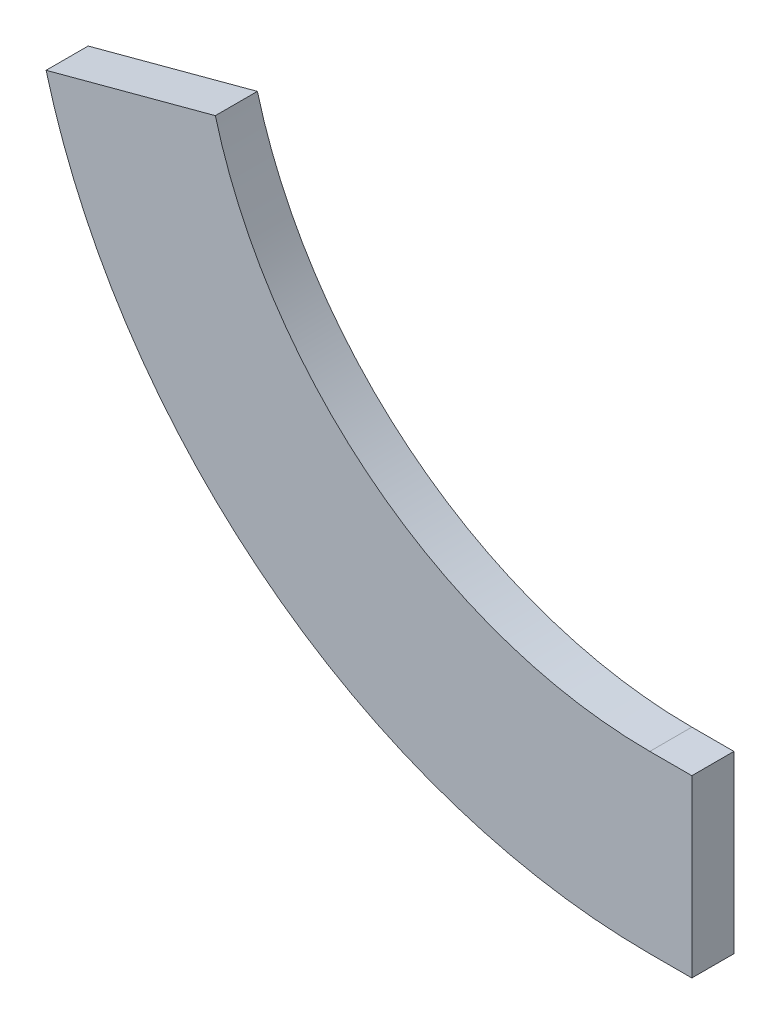
ISO-10303-21;
HEADER;
FILE_DESCRIPTION(('STEP AP214'),'2;1');
FILE_NAME('part.step','',(''),(''),'','','');
FILE_SCHEMA(('AUTOMOTIVE_DESIGN { 1 0 10303 214 1 1 1 1 }'));
ENDSEC;
DATA;
#1=APPLICATION_CONTEXT('core data for automotive mechanical design processes');
#2=APPLICATION_PROTOCOL_DEFINITION('international standard','automotive_design',2000,#1);
#3=PRODUCT_CONTEXT('',#1,'mechanical');
#4=PRODUCT('Part','Part','',(#3));
#5=PRODUCT_RELATED_PRODUCT_CATEGORY('part','',(#4));
#6=PRODUCT_DEFINITION_FORMATION('','',#4);
#7=PRODUCT_DEFINITION_CONTEXT('part definition',#1,'design');
#8=PRODUCT_DEFINITION('design','',#6,#7);
#9=PRODUCT_DEFINITION_SHAPE('','',#8);
#10=(LENGTH_UNIT() NAMED_UNIT(*) SI_UNIT(.MILLI.,.METRE.));
#11=(NAMED_UNIT(*) PLANE_ANGLE_UNIT() SI_UNIT($,.RADIAN.));
#12=(NAMED_UNIT(*) SI_UNIT($,.STERADIAN.) SOLID_ANGLE_UNIT());
#13=UNCERTAINTY_MEASURE_WITH_UNIT(LENGTH_MEASURE(1.E-05),#10,'distance_accuracy_value','');
#14=(GEOMETRIC_REPRESENTATION_CONTEXT(3) GLOBAL_UNCERTAINTY_ASSIGNED_CONTEXT((#13)) GLOBAL_UNIT_ASSIGNED_CONTEXT((#10,
#11,#12)) REPRESENTATION_CONTEXT('',''));
#15=CARTESIAN_POINT('',(0.,0.,0.));
#16=DIRECTION('',(0.,0.,1.));
#17=DIRECTION('',(1.,0.,0.));
#18=AXIS2_PLACEMENT_3D('',#15,#16,#17);
#19=CARTESIAN_POINT('',(-113.978983967422,-7.58695337037057,1.524));
#20=DIRECTION('',(0.258819045102525,-0.965925826289067,0.));
#21=DIRECTION('',(-0.965925826289067,-0.258819045102525,0.));
#22=AXIS2_PLACEMENT_3D('',#19,#20,#21);
#23=PLANE('',#22);
#24=DIRECTION('',(0.,0.,1.));
#25=VECTOR('',#24,1.);
#26=CARTESIAN_POINT('',(-113.978983967422,-7.58695337037058,1.524));
#27=LINE('',#26,#25);
#28=CARTESIAN_POINT('',(-113.978983967422,-7.58695337037057,-1.524));
#29=VERTEX_POINT('',#28);
#30=CARTESIAN_POINT('',(-113.978983967422,-7.58695337037058,1.524));
#31=VERTEX_POINT('',#30);
#32=EDGE_CURVE('E11',#29,#31,#27,.T.);
#33=ORIENTED_EDGE('',*,*,#32,.F.);
#34=DIRECTION('',(-0.965925826289067,-0.258819045102525,0.));
#35=VECTOR('',#34,1.);
#36=CARTESIAN_POINT('',(-113.978983967422,-7.58695337037057,-1.524));
#37=LINE('',#36,#35);
#38=CARTESIAN_POINT('',(-126.246241961293,-10.8739552431726,-1.524));
#39=VERTEX_POINT('',#38);
#40=EDGE_CURVE('E110',#29,#39,#37,.T.);
#41=ORIENTED_EDGE('',*,*,#40,.T.);
#42=DIRECTION('',(0.,0.,1.));
#43=VECTOR('',#42,1.);
#44=CARTESIAN_POINT('',(-126.246241961293,-10.8739552431726,1.524));
#45=LINE('',#44,#43);
#46=CARTESIAN_POINT('',(-126.246241961293,-10.8739552431726,1.524));
#47=VERTEX_POINT('',#46);
#48=EDGE_CURVE('E58',#39,#47,#45,.T.);
#49=ORIENTED_EDGE('',*,*,#48,.T.);
#50=DIRECTION('',(-0.965925826289067,-0.258819045102525,0.));
#51=VECTOR('',#50,1.);
#52=CARTESIAN_POINT('',(-113.978983967422,-7.58695337037057,1.524));
#53=LINE('',#52,#51);
#54=EDGE_CURVE('E149',#31,#47,#53,.T.);
#55=ORIENTED_EDGE('',*,*,#54,.F.);
#56=EDGE_LOOP('',(#33,#41,#49,#55));
#57=FACE_BOUND('',#56,.T.);
#58=ADVANCED_FACE('F47',(#57),#23,.F.);
#59=CARTESIAN_POINT('',(-82.4890885145437,0.850738685968811,1.524));
#60=DIRECTION('',(0.,0.,-1.));
#61=DIRECTION('',(-1.,0.,0.));
#62=AXIS2_PLACEMENT_3D('',#59,#60,#61);
#63=CYLINDRICAL_SURFACE('',#62,45.3007386859688);
#64=ORIENTED_EDGE('',*,*,#48,.F.);
#65=CARTESIAN_POINT('',(-82.4890885145437,0.850738685968811,-1.524));
#66=DIRECTION('',(0.,0.,1.));
#67=DIRECTION('',(1.,0.,0.));
#68=AXIS2_PLACEMENT_3D('',#65,#66,#67);
#69=CIRCLE('',#68,45.3007386859688);
#70=CARTESIAN_POINT('',(-82.4890885145437,-44.45,-1.524));
#71=VERTEX_POINT('',#70);
#72=EDGE_CURVE('E128',#39,#71,#69,.T.);
#73=ORIENTED_EDGE('',*,*,#72,.T.);
#74=DIRECTION('',(0.,0.,1.));
#75=VECTOR('',#74,1.);
#76=CARTESIAN_POINT('',(-82.4890885145437,-44.45,1.524));
#77=LINE('',#76,#75);
#78=CARTESIAN_POINT('',(-82.4890885145437,-44.45,1.524));
#79=VERTEX_POINT('',#78);
#80=EDGE_CURVE('E139',#71,#79,#77,.T.);
#81=ORIENTED_EDGE('',*,*,#80,.T.);
#82=CARTESIAN_POINT('',(-82.4890885145437,0.850738685968811,1.524));
#83=DIRECTION('',(0.,0.,1.));
#84=DIRECTION('',(1.,0.,0.));
#85=AXIS2_PLACEMENT_3D('',#82,#83,#84);
#86=CIRCLE('',#85,45.3007386859688);
#87=EDGE_CURVE('E157',#47,#79,#86,.T.);
#88=ORIENTED_EDGE('',*,*,#87,.F.);
#89=EDGE_LOOP('',(#64,#73,#81,#88));
#90=FACE_BOUND('',#89,.T.);
#91=ADVANCED_FACE('F161',(#90),#63,.T.);
#92=CARTESIAN_POINT('',(-82.4890885145437,-44.45,1.524));
#93=DIRECTION('',(0.,1.,0.));
#94=DIRECTION('',(1.,0.,0.));
#95=AXIS2_PLACEMENT_3D('',#92,#93,#94);
#96=PLANE('',#95);
#97=ORIENTED_EDGE('',*,*,#80,.F.);
#98=DIRECTION('',(-1.,0.,0.));
#99=VECTOR('',#98,1.);
#100=CARTESIAN_POINT('',(-82.4890885145437,-44.45,-1.524));
#101=LINE('',#100,#99);
#102=CARTESIAN_POINT('',(-79.4410885145437,-44.45,-1.524));
#103=VERTEX_POINT('',#102);
#104=EDGE_CURVE('E124',#71,#103,#101,.F.);
#105=ORIENTED_EDGE('',*,*,#104,.T.);
#106=DIRECTION('',(0.,0.,1.));
#107=VECTOR('',#106,1.);
#108=CARTESIAN_POINT('',(-79.4410885145437,-44.45,1.524));
#109=LINE('',#108,#107);
#110=CARTESIAN_POINT('',(-79.4410885145437,-44.45,1.524));
#111=VERTEX_POINT('',#110);
#112=EDGE_CURVE('E136',#103,#111,#109,.T.);
#113=ORIENTED_EDGE('',*,*,#112,.T.);
#114=DIRECTION('',(1.,0.,0.));
#115=VECTOR('',#114,1.);
#116=CARTESIAN_POINT('',(-82.4890885145437,-44.45,1.524));
#117=LINE('',#116,#115);
#118=EDGE_CURVE('E163',#79,#111,#117,.T.);
#119=ORIENTED_EDGE('',*,*,#118,.F.);
#120=EDGE_LOOP('',(#97,#105,#113,#119));
#121=FACE_BOUND('',#120,.T.);
#122=ADVANCED_FACE('F185',(#121),#96,.F.);
#123=CARTESIAN_POINT('',(-79.4410885145437,-44.45,1.524));
#124=DIRECTION('',(-1.,0.,0.));
#125=DIRECTION('',(0.,1.,0.));
#126=AXIS2_PLACEMENT_3D('',#123,#124,#125);
#127=PLANE('',#126);
#128=ORIENTED_EDGE('',*,*,#112,.F.);
#129=DIRECTION('',(0.,1.,0.));
#130=VECTOR('',#129,1.);
#131=CARTESIAN_POINT('',(-79.4410885145437,0.850738685968813,-1.524));
#132=LINE('',#131,#130);
#133=CARTESIAN_POINT('',(-79.4410885145437,-31.75,-1.524));
#134=VERTEX_POINT('',#133);
#135=EDGE_CURVE('E120',#103,#134,#132,.T.);
#136=ORIENTED_EDGE('',*,*,#135,.T.);
#137=DIRECTION('',(0.,0.,1.));
#138=VECTOR('',#137,1.);
#139=CARTESIAN_POINT('',(-79.4410885145437,-31.75,1.524));
#140=LINE('',#139,#138);
#141=CARTESIAN_POINT('',(-79.4410885145437,-31.75,1.524));
#142=VERTEX_POINT('',#141);
#143=EDGE_CURVE('E66',#134,#142,#140,.T.);
#144=ORIENTED_EDGE('',*,*,#143,.T.);
#145=DIRECTION('',(0.,1.,0.));
#146=VECTOR('',#145,1.);
#147=CARTESIAN_POINT('',(-79.4410885145437,-44.45,1.524));
#148=LINE('',#147,#146);
#149=EDGE_CURVE('E103',#111,#142,#148,.T.);
#150=ORIENTED_EDGE('',*,*,#149,.F.);
#151=EDGE_LOOP('',(#128,#136,#144,#150));
#152=FACE_BOUND('',#151,.T.);
#153=ADVANCED_FACE('F182',(#152),#127,.F.);
#154=CARTESIAN_POINT('',(-79.4410885145437,-31.75,1.524));
#155=DIRECTION('',(0.,-1.,0.));
#156=DIRECTION('',(-1.,0.,0.));
#157=AXIS2_PLACEMENT_3D('',#154,#155,#156);
#158=PLANE('',#157);
#159=ORIENTED_EDGE('',*,*,#143,.F.);
#160=DIRECTION('',(-1.,0.,0.));
#161=VECTOR('',#160,1.);
#162=CARTESIAN_POINT('',(-82.4890885145437,-31.75,-1.524));
#163=LINE('',#162,#161);
#164=CARTESIAN_POINT('',(-82.4890885145437,-31.75,-1.524));
#165=VERTEX_POINT('',#164);
#166=EDGE_CURVE('E108',#134,#165,#163,.T.);
#167=ORIENTED_EDGE('',*,*,#166,.T.);
#168=DIRECTION('',(0.,0.,1.));
#169=VECTOR('',#168,1.);
#170=CARTESIAN_POINT('',(-82.4890885145437,-31.75,1.524));
#171=LINE('',#170,#169);
#172=CARTESIAN_POINT('',(-82.4890885145437,-31.75,1.524));
#173=VERTEX_POINT('',#172);
#174=EDGE_CURVE('E51',#165,#173,#171,.T.);
#175=ORIENTED_EDGE('',*,*,#174,.T.);
#176=DIRECTION('',(-1.,0.,0.));
#177=VECTOR('',#176,1.);
#178=CARTESIAN_POINT('',(-79.4410885145437,-31.75,1.524));
#179=LINE('',#178,#177);
#180=EDGE_CURVE('E123',#142,#173,#179,.T.);
#181=ORIENTED_EDGE('',*,*,#180,.F.);
#182=EDGE_LOOP('',(#159,#167,#175,#181));
#183=FACE_BOUND('',#182,.T.);
#184=ADVANCED_FACE('F113',(#183),#158,.F.);
#185=CARTESIAN_POINT('',(-82.4890885145437,0.850738685968813,1.524));
#186=DIRECTION('',(0.,0.,-1.));
#187=DIRECTION('',(-1.,0.,0.));
#188=AXIS2_PLACEMENT_3D('',#185,#186,#187);
#189=CYLINDRICAL_SURFACE('',#188,32.6007386859688);
#190=CARTESIAN_POINT('',(-82.4890885145437,0.850738685968813,-1.524));
#191=DIRECTION('',(0.,0.,-1.));
#192=DIRECTION('',(-1.,0.,0.));
#193=AXIS2_PLACEMENT_3D('',#190,#191,#192);
#194=CIRCLE('',#193,32.6007386859688);
#195=EDGE_CURVE('E96',#165,#29,#194,.T.);
#196=ORIENTED_EDGE('',*,*,#195,.T.);
#197=ORIENTED_EDGE('',*,*,#32,.T.);
#198=CARTESIAN_POINT('',(-82.4890885145437,0.850738685968813,1.524));
#199=DIRECTION('',(0.,0.,-1.));
#200=DIRECTION('',(-1.,0.,0.));
#201=AXIS2_PLACEMENT_3D('',#198,#199,#200);
#202=CIRCLE('',#201,32.6007386859688);
#203=EDGE_CURVE('E98',#173,#31,#202,.T.);
#204=ORIENTED_EDGE('',*,*,#203,.F.);
#205=ORIENTED_EDGE('',*,*,#174,.F.);
#206=EDGE_LOOP('',(#196,#197,#204,#205));
#207=FACE_BOUND('',#206,.T.);
#208=ADVANCED_FACE('F49',(#207),#189,.F.);
#209=CARTESIAN_POINT('',(-82.4890885145437,0.850738685968813,1.524));
#210=DIRECTION('',(0.,0.,-1.));
#211=DIRECTION('',(-1.,0.,0.));
#212=AXIS2_PLACEMENT_3D('',#209,#210,#211);
#213=PLANE('',#212);
#214=ORIENTED_EDGE('',*,*,#180,.T.);
#215=ORIENTED_EDGE('',*,*,#203,.T.);
#216=ORIENTED_EDGE('',*,*,#54,.T.);
#217=ORIENTED_EDGE('',*,*,#87,.T.);
#218=ORIENTED_EDGE('',*,*,#118,.T.);
#219=ORIENTED_EDGE('',*,*,#149,.T.);
#220=EDGE_LOOP('',(#214,#215,#216,#217,#218,#219));
#221=FACE_BOUND('',#220,.T.);
#222=ADVANCED_FACE('F155',(#221),#213,.F.);
#223=CARTESIAN_POINT('',(-82.4890885145437,0.850738685968813,-1.524));
#224=DIRECTION('',(0.,0.,-1.));
#225=DIRECTION('',(-1.,0.,0.));
#226=AXIS2_PLACEMENT_3D('',#223,#224,#225);
#227=PLANE('',#226);
#228=ORIENTED_EDGE('',*,*,#166,.F.);
#229=ORIENTED_EDGE('',*,*,#135,.F.);
#230=ORIENTED_EDGE('',*,*,#104,.F.);
#231=ORIENTED_EDGE('',*,*,#72,.F.);
#232=ORIENTED_EDGE('',*,*,#40,.F.);
#233=ORIENTED_EDGE('',*,*,#195,.F.);
#234=EDGE_LOOP('',(#228,#229,#230,#231,#232,#233));
#235=FACE_BOUND('',#234,.T.);
#236=ADVANCED_FACE('F106',(#235),#227,.T.);
#237=CLOSED_SHELL('',(#58,#91,#122,#153,#184,#208,#222,#236));
#238=MANIFOLD_SOLID_BREP('B2',#237);
#239=ADVANCED_BREP_SHAPE_REPRESENTATION('',(#18,#238),#14);
#240=SHAPE_DEFINITION_REPRESENTATION(#9,#239);
ENDSEC;
END-ISO-10303-21;
